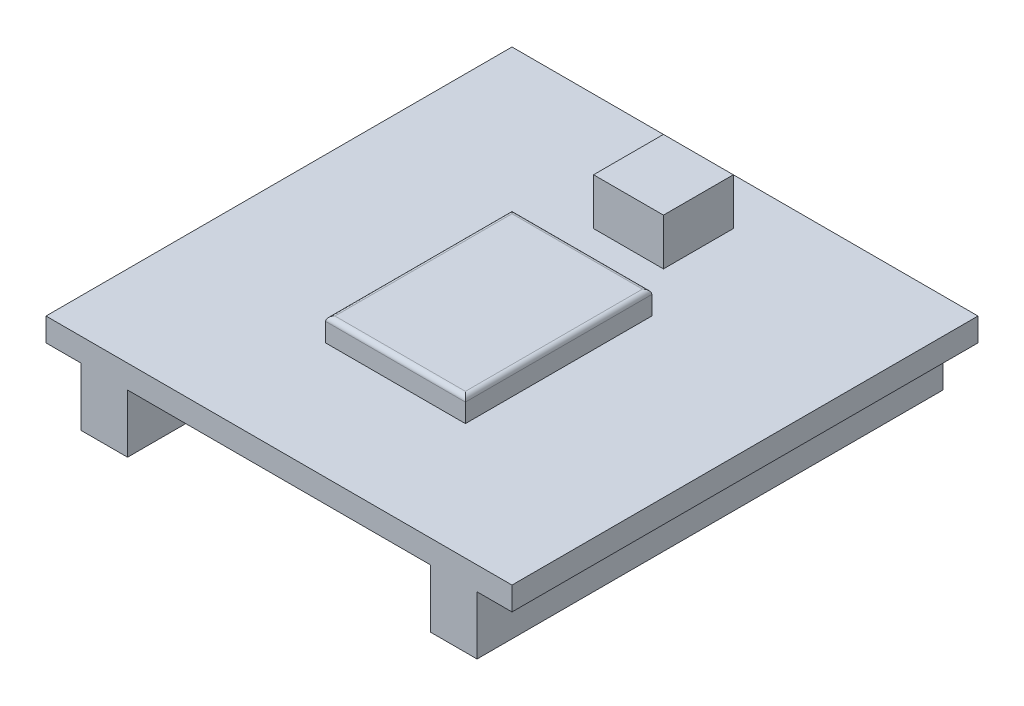
ISO-10303-21;
HEADER;
FILE_DESCRIPTION(('STEP AP214'),'2;1');
FILE_NAME('part.step','',(''),(''),'','','');
FILE_SCHEMA(('AUTOMOTIVE_DESIGN { 1 0 10303 214 1 1 1 1 }'));
ENDSEC;
DATA;
#1=APPLICATION_CONTEXT('core data for automotive mechanical design processes');
#2=APPLICATION_PROTOCOL_DEFINITION('international standard','automotive_design',2000,#1);
#3=PRODUCT_CONTEXT('',#1,'mechanical');
#4=PRODUCT('Part','Part','',(#3));
#5=PRODUCT_RELATED_PRODUCT_CATEGORY('part','',(#4));
#6=PRODUCT_DEFINITION_FORMATION('','',#4);
#7=PRODUCT_DEFINITION_CONTEXT('part definition',#1,'design');
#8=PRODUCT_DEFINITION('design','',#6,#7);
#9=PRODUCT_DEFINITION_SHAPE('','',#8);
#10=(LENGTH_UNIT() NAMED_UNIT(*) SI_UNIT(.MILLI.,.METRE.));
#11=(NAMED_UNIT(*) PLANE_ANGLE_UNIT() SI_UNIT($,.RADIAN.));
#12=(NAMED_UNIT(*) SI_UNIT($,.STERADIAN.) SOLID_ANGLE_UNIT());
#13=UNCERTAINTY_MEASURE_WITH_UNIT(LENGTH_MEASURE(1.E-05),#10,'distance_accuracy_value','');
#14=(GEOMETRIC_REPRESENTATION_CONTEXT(3) GLOBAL_UNCERTAINTY_ASSIGNED_CONTEXT((#13)) GLOBAL_UNIT_ASSIGNED_CONTEXT((#10,
#11,#12)) REPRESENTATION_CONTEXT('',''));
#15=CARTESIAN_POINT('',(0.,0.,0.));
#16=DIRECTION('',(0.,0.,1.));
#17=DIRECTION('',(1.,0.,0.));
#18=AXIS2_PLACEMENT_3D('',#15,#16,#17);
#19=CARTESIAN_POINT('',(0.,0.,0.));
#20=DIRECTION('',(0.,-1.,0.));
#21=DIRECTION('',(0.,0.,-1.));
#22=AXIS2_PLACEMENT_3D('',#19,#20,#21);
#23=PLANE('',#22);
#24=DIRECTION('',(1.,0.,0.));
#25=VECTOR('',#24,1.);
#26=CARTESIAN_POINT('',(-10.,0.,10.));
#27=LINE('',#26,#25);
#28=CARTESIAN_POINT('',(8.5,0.,10.));
#29=VERTEX_POINT('',#28);
#30=CARTESIAN_POINT('',(10.,0.,10.));
#31=VERTEX_POINT('',#30);
#32=EDGE_CURVE('E312',#29,#31,#27,.T.);
#33=ORIENTED_EDGE('',*,*,#32,.F.);
#34=DIRECTION('',(0.,0.,1.));
#35=VECTOR('',#34,1.);
#36=CARTESIAN_POINT('',(8.5,0.,-10.));
#37=LINE('',#36,#35);
#38=CARTESIAN_POINT('',(8.5,0.,-10.));
#39=VERTEX_POINT('',#38);
#40=EDGE_CURVE('E50',#39,#29,#37,.T.);
#41=ORIENTED_EDGE('',*,*,#40,.F.);
#42=DIRECTION('',(-1.,0.,0.));
#43=VECTOR('',#42,1.);
#44=CARTESIAN_POINT('',(-10.,0.,-10.));
#45=LINE('',#44,#43);
#46=CARTESIAN_POINT('',(10.,0.,-10.));
#47=VERTEX_POINT('',#46);
#48=EDGE_CURVE('E307',#47,#39,#45,.T.);
#49=ORIENTED_EDGE('',*,*,#48,.F.);
#50=DIRECTION('',(0.,0.,-1.));
#51=VECTOR('',#50,1.);
#52=CARTESIAN_POINT('',(10.,0.,10.));
#53=LINE('',#52,#51);
#54=EDGE_CURVE('E292',#31,#47,#53,.T.);
#55=ORIENTED_EDGE('',*,*,#54,.F.);
#56=EDGE_LOOP('',(#33,#41,#49,#55));
#57=FACE_BOUND('',#56,.T.);
#58=ADVANCED_FACE('F33',(#57),#23,.T.);
#59=CARTESIAN_POINT('',(6.5,0.,-10.));
#60=VERTEX_POINT('',#59);
#61=CARTESIAN_POINT('',(-6.5,0.,-10.));
#62=VERTEX_POINT('',#61);
#63=EDGE_CURVE('E58',#60,#62,#45,.T.);
#64=ORIENTED_EDGE('',*,*,#63,.F.);
#65=DIRECTION('',(0.,0.,-1.));
#66=VECTOR('',#65,1.);
#67=CARTESIAN_POINT('',(6.5,0.,-10.));
#68=LINE('',#67,#66);
#69=CARTESIAN_POINT('',(6.5,0.,10.));
#70=VERTEX_POINT('',#69);
#71=EDGE_CURVE('E203',#70,#60,#68,.T.);
#72=ORIENTED_EDGE('',*,*,#71,.F.);
#73=CARTESIAN_POINT('',(-6.5,0.,10.));
#74=VERTEX_POINT('',#73);
#75=EDGE_CURVE('E314',#74,#70,#27,.T.);
#76=ORIENTED_EDGE('',*,*,#75,.F.);
#77=DIRECTION('',(0.,0.,1.));
#78=VECTOR('',#77,1.);
#79=CARTESIAN_POINT('',(-6.5,0.,-10.));
#80=LINE('',#79,#78);
#81=EDGE_CURVE('E206',#62,#74,#80,.T.);
#82=ORIENTED_EDGE('',*,*,#81,.F.);
#83=EDGE_LOOP('',(#64,#72,#76,#82));
#84=FACE_BOUND('',#83,.T.);
#85=ADVANCED_FACE('F389',(#84),#23,.T.);
#86=CARTESIAN_POINT('',(0.,1.,0.));
#87=DIRECTION('',(0.,-1.,0.));
#88=DIRECTION('',(0.,0.,-1.));
#89=AXIS2_PLACEMENT_3D('',#86,#87,#88);
#90=PLANE('',#89);
#91=DIRECTION('',(0.,0.,-1.));
#92=VECTOR('',#91,1.);
#93=CARTESIAN_POINT('',(3.,1.,-3.));
#94=LINE('',#93,#92);
#95=CARTESIAN_POINT('',(3.,1.,5.));
#96=VERTEX_POINT('',#95);
#97=CARTESIAN_POINT('',(3.,1.,-3.));
#98=VERTEX_POINT('',#97);
#99=EDGE_CURVE('E272',#96,#98,#94,.T.);
#100=ORIENTED_EDGE('',*,*,#99,.F.);
#101=DIRECTION('',(1.,0.,0.));
#102=VECTOR('',#101,1.);
#103=CARTESIAN_POINT('',(-3.,1.,5.));
#104=LINE('',#103,#102);
#105=CARTESIAN_POINT('',(-3.,1.,5.));
#106=VERTEX_POINT('',#105);
#107=EDGE_CURVE('E281',#106,#96,#104,.T.);
#108=ORIENTED_EDGE('',*,*,#107,.F.);
#109=DIRECTION('',(0.,0.,1.));
#110=VECTOR('',#109,1.);
#111=CARTESIAN_POINT('',(-3.,1.,-3.));
#112=LINE('',#111,#110);
#113=CARTESIAN_POINT('',(-3.,1.,-3.));
#114=VERTEX_POINT('',#113);
#115=EDGE_CURVE('E278',#114,#106,#112,.T.);
#116=ORIENTED_EDGE('',*,*,#115,.F.);
#117=DIRECTION('',(-1.,0.,0.));
#118=VECTOR('',#117,1.);
#119=CARTESIAN_POINT('',(-3.,1.,-3.));
#120=LINE('',#119,#118);
#121=EDGE_CURVE('E275',#98,#114,#120,.T.);
#122=ORIENTED_EDGE('',*,*,#121,.F.);
#123=EDGE_LOOP('',(#100,#108,#116,#122));
#124=FACE_BOUND('',#123,.T.);
#125=DIRECTION('',(0.,0.,-1.));
#126=VECTOR('',#125,1.);
#127=CARTESIAN_POINT('',(10.,1.,10.));
#128=LINE('',#127,#126);
#129=CARTESIAN_POINT('',(10.,1.,10.));
#130=VERTEX_POINT('',#129);
#131=CARTESIAN_POINT('',(10.,1.,-10.));
#132=VERTEX_POINT('',#131);
#133=EDGE_CURVE('E293',#130,#132,#128,.T.);
#134=ORIENTED_EDGE('',*,*,#133,.T.);
#135=DIRECTION('',(-1.,0.,0.));
#136=VECTOR('',#135,1.);
#137=CARTESIAN_POINT('',(-10.,1.,-10.));
#138=LINE('',#137,#136);
#139=CARTESIAN_POINT('',(-10.,1.,-10.));
#140=VERTEX_POINT('',#139);
#141=EDGE_CURVE('E296',#132,#140,#138,.T.);
#142=ORIENTED_EDGE('',*,*,#141,.T.);
#143=DIRECTION('',(0.,0.,1.));
#144=VECTOR('',#143,1.);
#145=CARTESIAN_POINT('',(-10.,1.,10.));
#146=LINE('',#145,#144);
#147=CARTESIAN_POINT('',(-10.,1.,10.));
#148=VERTEX_POINT('',#147);
#149=EDGE_CURVE('E299',#140,#148,#146,.T.);
#150=ORIENTED_EDGE('',*,*,#149,.T.);
#151=DIRECTION('',(1.,0.,0.));
#152=VECTOR('',#151,1.);
#153=CARTESIAN_POINT('',(-10.,1.,10.));
#154=LINE('',#153,#152);
#155=EDGE_CURVE('E301',#148,#130,#154,.T.);
#156=ORIENTED_EDGE('',*,*,#155,.T.);
#157=EDGE_LOOP('',(#134,#142,#150,#156));
#158=FACE_BOUND('',#157,.T.);
#159=DIRECTION('',(0.,0.,-1.));
#160=VECTOR('',#159,1.);
#161=CARTESIAN_POINT('',(1.5,1.,-8.));
#162=LINE('',#161,#160);
#163=CARTESIAN_POINT('',(1.5,1.,-5.));
#164=VERTEX_POINT('',#163);
#165=CARTESIAN_POINT('',(1.5,1.,-8.));
#166=VERTEX_POINT('',#165);
#167=EDGE_CURVE('E238',#164,#166,#162,.T.);
#168=ORIENTED_EDGE('',*,*,#167,.F.);
#169=DIRECTION('',(1.,0.,0.));
#170=VECTOR('',#169,1.);
#171=CARTESIAN_POINT('',(-1.5,1.,-5.));
#172=LINE('',#171,#170);
#173=CARTESIAN_POINT('',(-1.5,1.,-5.));
#174=VERTEX_POINT('',#173);
#175=EDGE_CURVE('E243',#174,#164,#172,.T.);
#176=ORIENTED_EDGE('',*,*,#175,.F.);
#177=DIRECTION('',(0.,0.,1.));
#178=VECTOR('',#177,1.);
#179=CARTESIAN_POINT('',(-1.5,1.,-8.));
#180=LINE('',#179,#178);
#181=CARTESIAN_POINT('',(-1.5,1.,-8.));
#182=VERTEX_POINT('',#181);
#183=EDGE_CURVE('E255',#182,#174,#180,.T.);
#184=ORIENTED_EDGE('',*,*,#183,.F.);
#185=DIRECTION('',(-1.,0.,0.));
#186=VECTOR('',#185,1.);
#187=CARTESIAN_POINT('',(-1.5,1.,-8.));
#188=LINE('',#187,#186);
#189=EDGE_CURVE('E252',#166,#182,#188,.T.);
#190=ORIENTED_EDGE('',*,*,#189,.F.);
#191=EDGE_LOOP('',(#168,#176,#184,#190));
#192=FACE_BOUND('',#191,.T.);
#193=ADVANCED_FACE('F370',(#124,#158,#192),#90,.F.);
#194=CARTESIAN_POINT('',(10.,1.,10.));
#195=DIRECTION('',(-1.,0.,0.));
#196=DIRECTION('',(0.,0.,1.));
#197=AXIS2_PLACEMENT_3D('',#194,#195,#196);
#198=PLANE('',#197);
#199=ORIENTED_EDGE('',*,*,#54,.T.);
#200=DIRECTION('',(0.,-1.,0.));
#201=VECTOR('',#200,1.);
#202=CARTESIAN_POINT('',(10.,1.,-10.));
#203=LINE('',#202,#201);
#204=EDGE_CURVE('E323',#132,#47,#203,.T.);
#205=ORIENTED_EDGE('',*,*,#204,.F.);
#206=ORIENTED_EDGE('',*,*,#133,.F.);
#207=DIRECTION('',(0.,-1.,0.));
#208=VECTOR('',#207,1.);
#209=CARTESIAN_POINT('',(10.,1.,10.));
#210=LINE('',#209,#208);
#211=EDGE_CURVE('E303',#130,#31,#210,.T.);
#212=ORIENTED_EDGE('',*,*,#211,.T.);
#213=EDGE_LOOP('',(#199,#205,#206,#212));
#214=FACE_BOUND('',#213,.T.);
#215=ADVANCED_FACE('F428',(#214),#198,.F.);
#216=CARTESIAN_POINT('',(-10.,1.,-10.));
#217=DIRECTION('',(0.,0.,1.));
#218=DIRECTION('',(1.,0.,0.));
#219=AXIS2_PLACEMENT_3D('',#216,#217,#218);
#220=PLANE('',#219);
#221=ORIENTED_EDGE('',*,*,#48,.T.);
#222=DIRECTION('',(0.,1.,0.));
#223=VECTOR('',#222,1.);
#224=CARTESIAN_POINT('',(8.5,-2.5,-10.));
#225=LINE('',#224,#223);
#226=CARTESIAN_POINT('',(8.5,-2.5,-10.));
#227=VERTEX_POINT('',#226);
#228=EDGE_CURVE('E664',#227,#39,#225,.T.);
#229=ORIENTED_EDGE('',*,*,#228,.F.);
#230=DIRECTION('',(1.,0.,0.));
#231=VECTOR('',#230,1.);
#232=CARTESIAN_POINT('',(8.5,-2.5,-10.));
#233=LINE('',#232,#231);
#234=CARTESIAN_POINT('',(6.5,-2.5,-10.));
#235=VERTEX_POINT('',#234);
#236=EDGE_CURVE('E201',#235,#227,#233,.T.);
#237=ORIENTED_EDGE('',*,*,#236,.F.);
#238=DIRECTION('',(0.,1.,0.));
#239=VECTOR('',#238,1.);
#240=CARTESIAN_POINT('',(6.5,-2.5,-10.));
#241=LINE('',#240,#239);
#242=EDGE_CURVE('E211',#235,#60,#241,.T.);
#243=ORIENTED_EDGE('',*,*,#242,.T.);
#244=ORIENTED_EDGE('',*,*,#63,.T.);
#245=DIRECTION('',(0.,1.,0.));
#246=VECTOR('',#245,1.);
#247=CARTESIAN_POINT('',(-6.5,-2.5,-10.));
#248=LINE('',#247,#246);
#249=CARTESIAN_POINT('',(-6.5,-2.5,-10.));
#250=VERTEX_POINT('',#249);
#251=EDGE_CURVE('E223',#250,#62,#248,.T.);
#252=ORIENTED_EDGE('',*,*,#251,.F.);
#253=DIRECTION('',(1.,0.,0.));
#254=VECTOR('',#253,1.);
#255=CARTESIAN_POINT('',(-8.5,-2.5,-10.));
#256=LINE('',#255,#254);
#257=CARTESIAN_POINT('',(-8.5,-2.5,-10.));
#258=VERTEX_POINT('',#257);
#259=EDGE_CURVE('E222',#258,#250,#256,.T.);
#260=ORIENTED_EDGE('',*,*,#259,.F.);
#261=DIRECTION('',(0.,1.,0.));
#262=VECTOR('',#261,1.);
#263=CARTESIAN_POINT('',(-8.5,-2.5,-10.));
#264=LINE('',#263,#262);
#265=CARTESIAN_POINT('',(-8.5,0.,-10.));
#266=VERTEX_POINT('',#265);
#267=EDGE_CURVE('E229',#258,#266,#264,.T.);
#268=ORIENTED_EDGE('',*,*,#267,.T.);
#269=CARTESIAN_POINT('',(-10.,0.,-10.));
#270=VERTEX_POINT('',#269);
#271=EDGE_CURVE('E306',#266,#270,#45,.T.);
#272=ORIENTED_EDGE('',*,*,#271,.T.);
#273=DIRECTION('',(0.,-1.,0.));
#274=VECTOR('',#273,1.);
#275=CARTESIAN_POINT('',(-10.,1.,-10.));
#276=LINE('',#275,#274);
#277=EDGE_CURVE('E320',#140,#270,#276,.T.);
#278=ORIENTED_EDGE('',*,*,#277,.F.);
#279=ORIENTED_EDGE('',*,*,#141,.F.);
#280=ORIENTED_EDGE('',*,*,#204,.T.);
#281=EDGE_LOOP('',(#221,#229,#237,#243,#244,#252,#260,#268,#272,#278,#279,#280));
#282=FACE_BOUND('',#281,.T.);
#283=ADVANCED_FACE('F430',(#282),#220,.F.);
#284=CARTESIAN_POINT('',(-10.,1.,10.));
#285=DIRECTION('',(1.,0.,0.));
#286=DIRECTION('',(0.,0.,-1.));
#287=AXIS2_PLACEMENT_3D('',#284,#285,#286);
#288=PLANE('',#287);
#289=DIRECTION('',(0.,0.,1.));
#290=VECTOR('',#289,1.);
#291=CARTESIAN_POINT('',(-10.,0.,10.));
#292=LINE('',#291,#290);
#293=CARTESIAN_POINT('',(-10.,0.,10.));
#294=VERTEX_POINT('',#293);
#295=EDGE_CURVE('E310',#270,#294,#292,.T.);
#296=ORIENTED_EDGE('',*,*,#295,.T.);
#297=DIRECTION('',(0.,-1.,0.));
#298=VECTOR('',#297,1.);
#299=CARTESIAN_POINT('',(-10.,1.,10.));
#300=LINE('',#299,#298);
#301=EDGE_CURVE('E317',#148,#294,#300,.T.);
#302=ORIENTED_EDGE('',*,*,#301,.F.);
#303=ORIENTED_EDGE('',*,*,#149,.F.);
#304=ORIENTED_EDGE('',*,*,#277,.T.);
#305=EDGE_LOOP('',(#296,#302,#303,#304));
#306=FACE_BOUND('',#305,.T.);
#307=ADVANCED_FACE('F406',(#306),#288,.F.);
#308=CARTESIAN_POINT('',(-10.,1.,10.));
#309=DIRECTION('',(0.,0.,-1.));
#310=DIRECTION('',(-1.,0.,0.));
#311=AXIS2_PLACEMENT_3D('',#308,#309,#310);
#312=PLANE('',#311);
#313=CARTESIAN_POINT('',(-8.5,0.,10.));
#314=VERTEX_POINT('',#313);
#315=EDGE_CURVE('E297',#294,#314,#27,.T.);
#316=ORIENTED_EDGE('',*,*,#315,.T.);
#317=DIRECTION('',(0.,1.,0.));
#318=VECTOR('',#317,1.);
#319=CARTESIAN_POINT('',(-8.5,-2.5,10.));
#320=LINE('',#319,#318);
#321=CARTESIAN_POINT('',(-8.5,-2.5,10.));
#322=VERTEX_POINT('',#321);
#323=EDGE_CURVE('E232',#322,#314,#320,.T.);
#324=ORIENTED_EDGE('',*,*,#323,.F.);
#325=DIRECTION('',(-1.,0.,0.));
#326=VECTOR('',#325,1.);
#327=CARTESIAN_POINT('',(-8.5,-2.5,10.));
#328=LINE('',#327,#326);
#329=CARTESIAN_POINT('',(-6.5,-2.5,10.));
#330=VERTEX_POINT('',#329);
#331=EDGE_CURVE('E218',#330,#322,#328,.T.);
#332=ORIENTED_EDGE('',*,*,#331,.F.);
#333=DIRECTION('',(0.,1.,0.));
#334=VECTOR('',#333,1.);
#335=CARTESIAN_POINT('',(-6.5,-2.5,10.));
#336=LINE('',#335,#334);
#337=EDGE_CURVE('E235',#330,#74,#336,.T.);
#338=ORIENTED_EDGE('',*,*,#337,.T.);
#339=ORIENTED_EDGE('',*,*,#75,.T.);
#340=DIRECTION('',(0.,1.,0.));
#341=VECTOR('',#340,1.);
#342=CARTESIAN_POINT('',(6.5,-2.5,10.));
#343=LINE('',#342,#341);
#344=CARTESIAN_POINT('',(6.5,-2.5,10.));
#345=VERTEX_POINT('',#344);
#346=EDGE_CURVE('E192',#345,#70,#343,.T.);
#347=ORIENTED_EDGE('',*,*,#346,.F.);
#348=DIRECTION('',(-1.,0.,0.));
#349=VECTOR('',#348,1.);
#350=CARTESIAN_POINT('',(8.5,-2.5,10.));
#351=LINE('',#350,#349);
#352=CARTESIAN_POINT('',(8.5,-2.5,10.));
#353=VERTEX_POINT('',#352);
#354=EDGE_CURVE('E185',#353,#345,#351,.T.);
#355=ORIENTED_EDGE('',*,*,#354,.F.);
#356=DIRECTION('',(0.,1.,0.));
#357=VECTOR('',#356,1.);
#358=CARTESIAN_POINT('',(8.5,-2.5,10.));
#359=LINE('',#358,#357);
#360=EDGE_CURVE('E189',#353,#29,#359,.T.);
#361=ORIENTED_EDGE('',*,*,#360,.T.);
#362=ORIENTED_EDGE('',*,*,#32,.T.);
#363=ORIENTED_EDGE('',*,*,#211,.F.);
#364=ORIENTED_EDGE('',*,*,#155,.F.);
#365=ORIENTED_EDGE('',*,*,#301,.T.);
#366=EDGE_LOOP('',(#316,#324,#332,#338,#339,#347,#355,#361,#362,#363,#364,#365));
#367=FACE_BOUND('',#366,.T.);
#368=ADVANCED_FACE('F188',(#367),#312,.F.);
#369=DIRECTION('',(0.,0.,-1.));
#370=VECTOR('',#369,1.);
#371=CARTESIAN_POINT('',(-8.5,0.,-10.));
#372=LINE('',#371,#370);
#373=EDGE_CURVE('E209',#314,#266,#372,.T.);
#374=ORIENTED_EDGE('',*,*,#373,.F.);
#375=ORIENTED_EDGE('',*,*,#315,.F.);
#376=ORIENTED_EDGE('',*,*,#295,.F.);
#377=ORIENTED_EDGE('',*,*,#271,.F.);
#378=EDGE_LOOP('',(#374,#375,#376,#377));
#379=FACE_BOUND('',#378,.T.);
#380=ADVANCED_FACE('F392',(#379),#23,.T.);
#381=CARTESIAN_POINT('',(3.,2.,-3.));
#382=DIRECTION('',(-1.,0.,0.));
#383=DIRECTION('',(0.,0.,1.));
#384=AXIS2_PLACEMENT_3D('',#381,#382,#383);
#385=PLANE('',#384);
#386=DIRECTION('',(0.,-1.,0.));
#387=VECTOR('',#386,1.);
#388=CARTESIAN_POINT('',(3.,2.,-3.));
#389=LINE('',#388,#387);
#390=CARTESIAN_POINT('',(3.,1.8,-3.));
#391=VERTEX_POINT('',#390);
#392=EDGE_CURVE('E290',#391,#98,#389,.T.);
#393=ORIENTED_EDGE('',*,*,#392,.F.);
#394=DIRECTION('',(0.,0.,-1.));
#395=VECTOR('',#394,1.);
#396=CARTESIAN_POINT('',(3.,1.8,5.));
#397=LINE('',#396,#395);
#398=CARTESIAN_POINT('',(3.,1.8,5.));
#399=VERTEX_POINT('',#398);
#400=EDGE_CURVE('E11',#391,#399,#397,.F.);
#401=ORIENTED_EDGE('',*,*,#400,.T.);
#402=DIRECTION('',(0.,-1.,0.));
#403=VECTOR('',#402,1.);
#404=CARTESIAN_POINT('',(3.,2.,5.));
#405=LINE('',#404,#403);
#406=EDGE_CURVE('E284',#399,#96,#405,.T.);
#407=ORIENTED_EDGE('',*,*,#406,.T.);
#408=ORIENTED_EDGE('',*,*,#99,.T.);
#409=EDGE_LOOP('',(#393,#401,#407,#408));
#410=FACE_BOUND('',#409,.T.);
#411=ADVANCED_FACE('F365',(#410),#385,.F.);
#412=CARTESIAN_POINT('',(-3.,2.,-3.));
#413=DIRECTION('',(0.,0.,1.));
#414=DIRECTION('',(1.,0.,0.));
#415=AXIS2_PLACEMENT_3D('',#412,#413,#414);
#416=PLANE('',#415);
#417=DIRECTION('',(0.,-1.,0.));
#418=VECTOR('',#417,1.);
#419=CARTESIAN_POINT('',(-3.,2.,-3.));
#420=LINE('',#419,#418);
#421=CARTESIAN_POINT('',(-3.,1.8,-3.));
#422=VERTEX_POINT('',#421);
#423=EDGE_CURVE('E288',#422,#114,#420,.T.);
#424=ORIENTED_EDGE('',*,*,#423,.F.);
#425=DIRECTION('',(-1.,0.,0.));
#426=VECTOR('',#425,1.);
#427=CARTESIAN_POINT('',(3.,1.8,-3.));
#428=LINE('',#427,#426);
#429=EDGE_CURVE('E42',#422,#391,#428,.F.);
#430=ORIENTED_EDGE('',*,*,#429,.T.);
#431=ORIENTED_EDGE('',*,*,#392,.T.);
#432=ORIENTED_EDGE('',*,*,#121,.T.);
#433=EDGE_LOOP('',(#424,#430,#431,#432));
#434=FACE_BOUND('',#433,.T.);
#435=ADVANCED_FACE('F362',(#434),#416,.F.);
#436=CARTESIAN_POINT('',(-3.,2.,-3.));
#437=DIRECTION('',(1.,0.,0.));
#438=DIRECTION('',(0.,0.,-1.));
#439=AXIS2_PLACEMENT_3D('',#436,#437,#438);
#440=PLANE('',#439);
#441=DIRECTION('',(0.,-1.,0.));
#442=VECTOR('',#441,1.);
#443=CARTESIAN_POINT('',(-3.,2.,5.));
#444=LINE('',#443,#442);
#445=CARTESIAN_POINT('',(-3.,1.8,5.));
#446=VERTEX_POINT('',#445);
#447=EDGE_CURVE('E286',#446,#106,#444,.T.);
#448=ORIENTED_EDGE('',*,*,#447,.F.);
#449=DIRECTION('',(0.,0.,1.));
#450=VECTOR('',#449,1.);
#451=CARTESIAN_POINT('',(-3.,1.8,-3.));
#452=LINE('',#451,#450);
#453=EDGE_CURVE('E338',#446,#422,#452,.F.);
#454=ORIENTED_EDGE('',*,*,#453,.T.);
#455=ORIENTED_EDGE('',*,*,#423,.T.);
#456=ORIENTED_EDGE('',*,*,#115,.T.);
#457=EDGE_LOOP('',(#448,#454,#455,#456));
#458=FACE_BOUND('',#457,.T.);
#459=ADVANCED_FACE('F378',(#458),#440,.F.);
#460=CARTESIAN_POINT('',(-3.,2.,5.));
#461=DIRECTION('',(0.,0.,-1.));
#462=DIRECTION('',(-1.,0.,0.));
#463=AXIS2_PLACEMENT_3D('',#460,#461,#462);
#464=PLANE('',#463);
#465=ORIENTED_EDGE('',*,*,#406,.F.);
#466=DIRECTION('',(1.,0.,0.));
#467=VECTOR('',#466,1.);
#468=CARTESIAN_POINT('',(-3.,1.8,5.));
#469=LINE('',#468,#467);
#470=EDGE_CURVE('E335',#399,#446,#469,.F.);
#471=ORIENTED_EDGE('',*,*,#470,.T.);
#472=ORIENTED_EDGE('',*,*,#447,.T.);
#473=ORIENTED_EDGE('',*,*,#107,.T.);
#474=EDGE_LOOP('',(#465,#471,#472,#473));
#475=FACE_BOUND('',#474,.T.);
#476=ADVANCED_FACE('F374',(#475),#464,.F.);
#477=CARTESIAN_POINT('',(0.,2.,0.));
#478=DIRECTION('',(0.,1.,0.));
#479=DIRECTION('',(0.,0.,1.));
#480=AXIS2_PLACEMENT_3D('',#477,#478,#479);
#481=PLANE('',#480);
#482=DIRECTION('',(0.,0.,1.));
#483=VECTOR('',#482,1.);
#484=CARTESIAN_POINT('',(-2.8,2.,5.));
#485=LINE('',#484,#483);
#486=CARTESIAN_POINT('',(-2.8,2.,-2.8));
#487=VERTEX_POINT('',#486);
#488=CARTESIAN_POINT('',(-2.8,2.,4.8));
#489=VERTEX_POINT('',#488);
#490=EDGE_CURVE('E330',#487,#489,#485,.T.);
#491=ORIENTED_EDGE('',*,*,#490,.T.);
#492=DIRECTION('',(1.,0.,0.));
#493=VECTOR('',#492,1.);
#494=CARTESIAN_POINT('',(3.,2.,4.8));
#495=LINE('',#494,#493);
#496=CARTESIAN_POINT('',(2.8,2.,4.8));
#497=VERTEX_POINT('',#496);
#498=EDGE_CURVE('E332',#489,#497,#495,.T.);
#499=ORIENTED_EDGE('',*,*,#498,.T.);
#500=DIRECTION('',(0.,0.,-1.));
#501=VECTOR('',#500,1.);
#502=CARTESIAN_POINT('',(2.8,2.,-3.));
#503=LINE('',#502,#501);
#504=CARTESIAN_POINT('',(2.8,2.,-2.8));
#505=VERTEX_POINT('',#504);
#506=EDGE_CURVE('E326',#497,#505,#503,.T.);
#507=ORIENTED_EDGE('',*,*,#506,.T.);
#508=DIRECTION('',(-1.,0.,0.));
#509=VECTOR('',#508,1.);
#510=CARTESIAN_POINT('',(-3.,2.,-2.8));
#511=LINE('',#510,#509);
#512=EDGE_CURVE('E328',#505,#487,#511,.T.);
#513=ORIENTED_EDGE('',*,*,#512,.T.);
#514=EDGE_LOOP('',(#491,#499,#507,#513));
#515=FACE_BOUND('',#514,.T.);
#516=ADVANCED_FACE('F385',(#515),#481,.T.);
#517=CARTESIAN_POINT('',(0.,1.8,-2.8));
#518=DIRECTION('',(1.,0.,0.));
#519=DIRECTION('',(0.,0.,-1.));
#520=AXIS2_PLACEMENT_3D('',#517,#518,#519);
#521=CYLINDRICAL_SURFACE('',#520,0.2);
#522=CARTESIAN_POINT('',(2.8,1.8,-2.8));
#523=DIRECTION('',(0.707106781186547,0.,0.707106781186547));
#524=DIRECTION('',(-0.707106781186547,0.,0.707106781186547));
#525=AXIS2_PLACEMENT_3D('',#522,#523,#524);
#526=ELLIPSE('',#525,0.282842712474619,0.2);
#527=EDGE_CURVE('E343',#391,#505,#526,.T.);
#528=ORIENTED_EDGE('',*,*,#527,.F.);
#529=ORIENTED_EDGE('',*,*,#429,.F.);
#530=CARTESIAN_POINT('',(-2.8,1.8,-2.8));
#531=DIRECTION('',(0.707106781186547,0.,-0.707106781186548));
#532=DIRECTION('',(0.707106781186548,0.,0.707106781186547));
#533=AXIS2_PLACEMENT_3D('',#530,#531,#532);
#534=ELLIPSE('',#533,0.282842712474619,0.2);
#535=EDGE_CURVE('E37',#487,#422,#534,.F.);
#536=ORIENTED_EDGE('',*,*,#535,.F.);
#537=ORIENTED_EDGE('',*,*,#512,.F.);
#538=EDGE_LOOP('',(#528,#529,#536,#537));
#539=FACE_BOUND('',#538,.T.);
#540=ADVANCED_FACE('F35',(#539),#521,.T.);
#541=CARTESIAN_POINT('',(-2.8,1.8,0.));
#542=DIRECTION('',(0.,0.,-1.));
#543=DIRECTION('',(-1.,0.,0.));
#544=AXIS2_PLACEMENT_3D('',#541,#542,#543);
#545=CYLINDRICAL_SURFACE('',#544,0.2);
#546=ORIENTED_EDGE('',*,*,#535,.T.);
#547=ORIENTED_EDGE('',*,*,#453,.F.);
#548=CARTESIAN_POINT('',(-2.8,1.8,4.8));
#549=DIRECTION('',(-0.707106781186548,0.,-0.707106781186547));
#550=DIRECTION('',(0.707106781186547,0.,-0.707106781186548));
#551=AXIS2_PLACEMENT_3D('',#548,#549,#550);
#552=ELLIPSE('',#551,0.282842712474619,0.2);
#553=EDGE_CURVE('E342',#489,#446,#552,.F.);
#554=ORIENTED_EDGE('',*,*,#553,.F.);
#555=ORIENTED_EDGE('',*,*,#490,.F.);
#556=EDGE_LOOP('',(#546,#547,#554,#555));
#557=FACE_BOUND('',#556,.T.);
#558=ADVANCED_FACE('F354',(#557),#545,.T.);
#559=CARTESIAN_POINT('',(2.8,1.8,0.));
#560=DIRECTION('',(0.,0.,1.));
#561=DIRECTION('',(1.,0.,0.));
#562=AXIS2_PLACEMENT_3D('',#559,#560,#561);
#563=CYLINDRICAL_SURFACE('',#562,0.2);
#564=ORIENTED_EDGE('',*,*,#527,.T.);
#565=ORIENTED_EDGE('',*,*,#506,.F.);
#566=CARTESIAN_POINT('',(2.8,1.8,4.8));
#567=DIRECTION('',(-0.707106781186547,0.,0.707106781186547));
#568=DIRECTION('',(0.707106781186547,0.,0.707106781186547));
#569=AXIS2_PLACEMENT_3D('',#566,#567,#568);
#570=ELLIPSE('',#569,0.282842712474619,0.2);
#571=EDGE_CURVE('E271',#399,#497,#570,.T.);
#572=ORIENTED_EDGE('',*,*,#571,.F.);
#573=ORIENTED_EDGE('',*,*,#400,.F.);
#574=EDGE_LOOP('',(#564,#565,#572,#573));
#575=FACE_BOUND('',#574,.T.);
#576=ADVANCED_FACE('F448',(#575),#563,.T.);
#577=CARTESIAN_POINT('',(0.,1.8,4.8));
#578=DIRECTION('',(-1.,0.,0.));
#579=DIRECTION('',(0.,0.,1.));
#580=AXIS2_PLACEMENT_3D('',#577,#578,#579);
#581=CYLINDRICAL_SURFACE('',#580,0.2);
#582=ORIENTED_EDGE('',*,*,#553,.T.);
#583=ORIENTED_EDGE('',*,*,#470,.F.);
#584=ORIENTED_EDGE('',*,*,#571,.T.);
#585=ORIENTED_EDGE('',*,*,#498,.F.);
#586=EDGE_LOOP('',(#582,#583,#584,#585));
#587=FACE_BOUND('',#586,.T.);
#588=ADVANCED_FACE('F444',(#587),#581,.T.);
#589=CARTESIAN_POINT('',(1.5,3.,-8.));
#590=DIRECTION('',(-1.,0.,0.));
#591=DIRECTION('',(0.,0.,1.));
#592=AXIS2_PLACEMENT_3D('',#589,#590,#591);
#593=PLANE('',#592);
#594=ORIENTED_EDGE('',*,*,#167,.T.);
#595=DIRECTION('',(0.,-1.,0.));
#596=VECTOR('',#595,1.);
#597=CARTESIAN_POINT('',(1.5,3.,-8.));
#598=LINE('',#597,#596);
#599=CARTESIAN_POINT('',(1.5,3.,-8.));
#600=VERTEX_POINT('',#599);
#601=EDGE_CURVE('E268',#600,#166,#598,.T.);
#602=ORIENTED_EDGE('',*,*,#601,.F.);
#603=DIRECTION('',(0.,0.,-1.));
#604=VECTOR('',#603,1.);
#605=CARTESIAN_POINT('',(1.5,3.,-8.));
#606=LINE('',#605,#604);
#607=CARTESIAN_POINT('',(1.5,3.,-5.));
#608=VERTEX_POINT('',#607);
#609=EDGE_CURVE('E239',#608,#600,#606,.T.);
#610=ORIENTED_EDGE('',*,*,#609,.F.);
#611=DIRECTION('',(0.,-1.,0.));
#612=VECTOR('',#611,1.);
#613=CARTESIAN_POINT('',(1.5,3.,-5.));
#614=LINE('',#613,#612);
#615=EDGE_CURVE('E249',#608,#164,#614,.T.);
#616=ORIENTED_EDGE('',*,*,#615,.T.);
#617=EDGE_LOOP('',(#594,#602,#610,#616));
#618=FACE_BOUND('',#617,.T.);
#619=ADVANCED_FACE('F447',(#618),#593,.F.);
#620=CARTESIAN_POINT('',(-1.5,3.,-8.));
#621=DIRECTION('',(0.,0.,1.));
#622=DIRECTION('',(1.,0.,0.));
#623=AXIS2_PLACEMENT_3D('',#620,#621,#622);
#624=PLANE('',#623);
#625=ORIENTED_EDGE('',*,*,#189,.T.);
#626=DIRECTION('',(0.,-1.,0.));
#627=VECTOR('',#626,1.);
#628=CARTESIAN_POINT('',(-1.5,3.,-8.));
#629=LINE('',#628,#627);
#630=CARTESIAN_POINT('',(-1.5,3.,-8.));
#631=VERTEX_POINT('',#630);
#632=EDGE_CURVE('E265',#631,#182,#629,.T.);
#633=ORIENTED_EDGE('',*,*,#632,.F.);
#634=DIRECTION('',(-1.,0.,0.));
#635=VECTOR('',#634,1.);
#636=CARTESIAN_POINT('',(-1.5,3.,-8.));
#637=LINE('',#636,#635);
#638=EDGE_CURVE('E242',#600,#631,#637,.T.);
#639=ORIENTED_EDGE('',*,*,#638,.F.);
#640=ORIENTED_EDGE('',*,*,#601,.T.);
#641=EDGE_LOOP('',(#625,#633,#639,#640));
#642=FACE_BOUND('',#641,.T.);
#643=ADVANCED_FACE('F465',(#642),#624,.F.);
#644=CARTESIAN_POINT('',(-1.5,3.,-8.));
#645=DIRECTION('',(1.,0.,0.));
#646=DIRECTION('',(0.,0.,-1.));
#647=AXIS2_PLACEMENT_3D('',#644,#645,#646);
#648=PLANE('',#647);
#649=ORIENTED_EDGE('',*,*,#183,.T.);
#650=DIRECTION('',(0.,-1.,0.));
#651=VECTOR('',#650,1.);
#652=CARTESIAN_POINT('',(-1.5,3.,-5.));
#653=LINE('',#652,#651);
#654=CARTESIAN_POINT('',(-1.5,3.,-5.));
#655=VERTEX_POINT('',#654);
#656=EDGE_CURVE('E262',#655,#174,#653,.T.);
#657=ORIENTED_EDGE('',*,*,#656,.F.);
#658=DIRECTION('',(0.,0.,1.));
#659=VECTOR('',#658,1.);
#660=CARTESIAN_POINT('',(-1.5,3.,-8.));
#661=LINE('',#660,#659);
#662=EDGE_CURVE('E245',#631,#655,#661,.T.);
#663=ORIENTED_EDGE('',*,*,#662,.F.);
#664=ORIENTED_EDGE('',*,*,#632,.T.);
#665=EDGE_LOOP('',(#649,#657,#663,#664));
#666=FACE_BOUND('',#665,.T.);
#667=ADVANCED_FACE('F469',(#666),#648,.F.);
#668=CARTESIAN_POINT('',(-1.5,3.,-5.));
#669=DIRECTION('',(0.,0.,-1.));
#670=DIRECTION('',(-1.,0.,0.));
#671=AXIS2_PLACEMENT_3D('',#668,#669,#670);
#672=PLANE('',#671);
#673=ORIENTED_EDGE('',*,*,#175,.T.);
#674=ORIENTED_EDGE('',*,*,#615,.F.);
#675=DIRECTION('',(1.,0.,0.));
#676=VECTOR('',#675,1.);
#677=CARTESIAN_POINT('',(-1.5,3.,-5.));
#678=LINE('',#677,#676);
#679=EDGE_CURVE('E247',#655,#608,#678,.T.);
#680=ORIENTED_EDGE('',*,*,#679,.F.);
#681=ORIENTED_EDGE('',*,*,#656,.T.);
#682=EDGE_LOOP('',(#673,#674,#680,#681));
#683=FACE_BOUND('',#682,.T.);
#684=ADVANCED_FACE('F473',(#683),#672,.F.);
#685=CARTESIAN_POINT('',(0.,3.,0.));
#686=DIRECTION('',(0.,1.,0.));
#687=DIRECTION('',(0.,0.,1.));
#688=AXIS2_PLACEMENT_3D('',#685,#686,#687);
#689=PLANE('',#688);
#690=ORIENTED_EDGE('',*,*,#609,.T.);
#691=ORIENTED_EDGE('',*,*,#638,.T.);
#692=ORIENTED_EDGE('',*,*,#662,.T.);
#693=ORIENTED_EDGE('',*,*,#679,.T.);
#694=EDGE_LOOP('',(#690,#691,#692,#693));
#695=FACE_BOUND('',#694,.T.);
#696=ADVANCED_FACE('F477',(#695),#689,.T.);
#697=CARTESIAN_POINT('',(-6.5,-2.5,-10.));
#698=DIRECTION('',(-1.,0.,0.));
#699=DIRECTION('',(0.,0.,1.));
#700=AXIS2_PLACEMENT_3D('',#697,#698,#699);
#701=PLANE('',#700);
#702=ORIENTED_EDGE('',*,*,#81,.T.);
#703=ORIENTED_EDGE('',*,*,#337,.F.);
#704=DIRECTION('',(0.,0.,1.));
#705=VECTOR('',#704,1.);
#706=CARTESIAN_POINT('',(-6.5,-2.5,-10.));
#707=LINE('',#706,#705);
#708=EDGE_CURVE('E215',#250,#330,#707,.T.);
#709=ORIENTED_EDGE('',*,*,#708,.F.);
#710=ORIENTED_EDGE('',*,*,#251,.T.);
#711=EDGE_LOOP('',(#702,#703,#709,#710));
#712=FACE_BOUND('',#711,.T.);
#713=ADVANCED_FACE('F422',(#712),#701,.F.);
#714=CARTESIAN_POINT('',(-8.5,-2.5,-10.));
#715=DIRECTION('',(1.,0.,0.));
#716=DIRECTION('',(0.,0.,-1.));
#717=AXIS2_PLACEMENT_3D('',#714,#715,#716);
#718=PLANE('',#717);
#719=ORIENTED_EDGE('',*,*,#373,.T.);
#720=ORIENTED_EDGE('',*,*,#267,.F.);
#721=DIRECTION('',(0.,0.,-1.));
#722=VECTOR('',#721,1.);
#723=CARTESIAN_POINT('',(-8.5,-2.5,-10.));
#724=LINE('',#723,#722);
#725=EDGE_CURVE('E220',#322,#258,#724,.T.);
#726=ORIENTED_EDGE('',*,*,#725,.F.);
#727=ORIENTED_EDGE('',*,*,#323,.T.);
#728=EDGE_LOOP('',(#719,#720,#726,#727));
#729=FACE_BOUND('',#728,.T.);
#730=ADVANCED_FACE('F415',(#729),#718,.F.);
#731=CARTESIAN_POINT('',(0.,-2.5,0.));
#732=DIRECTION('',(0.,1.,0.));
#733=DIRECTION('',(0.,0.,1.));
#734=AXIS2_PLACEMENT_3D('',#731,#732,#733);
#735=PLANE('',#734);
#736=ORIENTED_EDGE('',*,*,#708,.T.);
#737=ORIENTED_EDGE('',*,*,#331,.T.);
#738=ORIENTED_EDGE('',*,*,#725,.T.);
#739=ORIENTED_EDGE('',*,*,#259,.T.);
#740=EDGE_LOOP('',(#736,#737,#738,#739));
#741=FACE_BOUND('',#740,.T.);
#742=ADVANCED_FACE('F418',(#741),#735,.F.);
#743=CARTESIAN_POINT('',(8.5,-2.5,-10.));
#744=DIRECTION('',(-1.,0.,0.));
#745=DIRECTION('',(0.,0.,1.));
#746=AXIS2_PLACEMENT_3D('',#743,#744,#745);
#747=PLANE('',#746);
#748=ORIENTED_EDGE('',*,*,#40,.T.);
#749=ORIENTED_EDGE('',*,*,#360,.F.);
#750=DIRECTION('',(0.,0.,1.));
#751=VECTOR('',#750,1.);
#752=CARTESIAN_POINT('',(8.5,-2.5,-10.));
#753=LINE('',#752,#751);
#754=EDGE_CURVE('E196',#227,#353,#753,.T.);
#755=ORIENTED_EDGE('',*,*,#754,.F.);
#756=ORIENTED_EDGE('',*,*,#228,.T.);
#757=EDGE_LOOP('',(#748,#749,#755,#756));
#758=FACE_BOUND('',#757,.T.);
#759=ADVANCED_FACE('F205',(#758),#747,.F.);
#760=CARTESIAN_POINT('',(6.5,-2.5,-10.));
#761=DIRECTION('',(1.,0.,0.));
#762=DIRECTION('',(0.,0.,-1.));
#763=AXIS2_PLACEMENT_3D('',#760,#761,#762);
#764=PLANE('',#763);
#765=ORIENTED_EDGE('',*,*,#71,.T.);
#766=ORIENTED_EDGE('',*,*,#242,.F.);
#767=DIRECTION('',(0.,0.,-1.));
#768=VECTOR('',#767,1.);
#769=CARTESIAN_POINT('',(6.5,-2.5,-10.));
#770=LINE('',#769,#768);
#771=EDGE_CURVE('E195',#345,#235,#770,.T.);
#772=ORIENTED_EDGE('',*,*,#771,.F.);
#773=ORIENTED_EDGE('',*,*,#346,.T.);
#774=EDGE_LOOP('',(#765,#766,#772,#773));
#775=FACE_BOUND('',#774,.T.);
#776=ADVANCED_FACE('F490',(#775),#764,.F.);
#777=CARTESIAN_POINT('',(0.,-2.5,0.));
#778=DIRECTION('',(0.,-1.,0.));
#779=DIRECTION('',(0.,0.,-1.));
#780=AXIS2_PLACEMENT_3D('',#777,#778,#779);
#781=PLANE('',#780);
#782=ORIENTED_EDGE('',*,*,#754,.T.);
#783=ORIENTED_EDGE('',*,*,#354,.T.);
#784=ORIENTED_EDGE('',*,*,#771,.T.);
#785=ORIENTED_EDGE('',*,*,#236,.T.);
#786=EDGE_LOOP('',(#782,#783,#784,#785));
#787=FACE_BOUND('',#786,.T.);
#788=ADVANCED_FACE('F199',(#787),#781,.T.);
#789=CLOSED_SHELL('',(#58,#85,#193,#215,#283,#307,#368,#380,#411,#435,#459,#476,#516,#540,#558,
#576,#588,#619,#643,#667,#684,#696,#713,#730,#742,#759,#776,#788));
#790=MANIFOLD_SOLID_BREP('B2',#789);
#791=ADVANCED_BREP_SHAPE_REPRESENTATION('',(#18,#790),#14);
#792=SHAPE_DEFINITION_REPRESENTATION(#9,#791);
ENDSEC;
END-ISO-10303-21;
